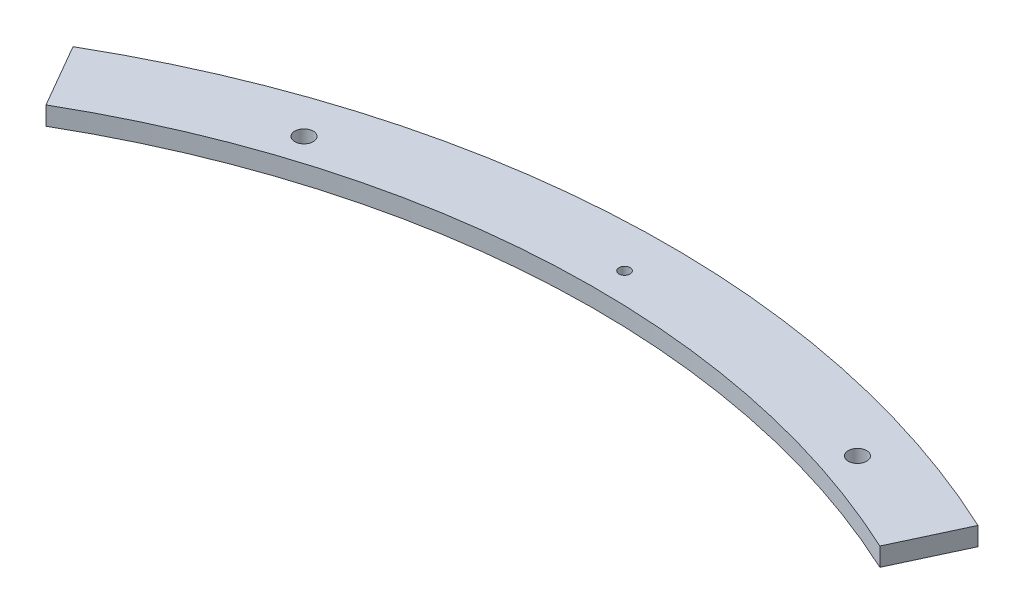
ISO-10303-21;
HEADER;
FILE_DESCRIPTION(('STEP AP214'),'2;1');
FILE_NAME('part.step','',(''),(''),'','','');
FILE_SCHEMA(('AUTOMOTIVE_DESIGN { 1 0 10303 214 1 1 1 1 }'));
ENDSEC;
DATA;
#1=APPLICATION_CONTEXT('core data for automotive mechanical design processes');
#2=APPLICATION_PROTOCOL_DEFINITION('international standard','automotive_design',2000,#1);
#3=PRODUCT_CONTEXT('',#1,'mechanical');
#4=PRODUCT('Part','Part','',(#3));
#5=PRODUCT_RELATED_PRODUCT_CATEGORY('part','',(#4));
#6=PRODUCT_DEFINITION_FORMATION('','',#4);
#7=PRODUCT_DEFINITION_CONTEXT('part definition',#1,'design');
#8=PRODUCT_DEFINITION('design','',#6,#7);
#9=PRODUCT_DEFINITION_SHAPE('','',#8);
#10=(LENGTH_UNIT() NAMED_UNIT(*) SI_UNIT(.MILLI.,.METRE.));
#11=(NAMED_UNIT(*) PLANE_ANGLE_UNIT() SI_UNIT($,.RADIAN.));
#12=(NAMED_UNIT(*) SI_UNIT($,.STERADIAN.) SOLID_ANGLE_UNIT());
#13=UNCERTAINTY_MEASURE_WITH_UNIT(LENGTH_MEASURE(1.E-05),#10,'distance_accuracy_value','');
#14=(GEOMETRIC_REPRESENTATION_CONTEXT(3) GLOBAL_UNCERTAINTY_ASSIGNED_CONTEXT((#13)) GLOBAL_UNIT_ASSIGNED_CONTEXT((#10,
#11,#12)) REPRESENTATION_CONTEXT('',''));
#15=CARTESIAN_POINT('',(0.,0.,0.));
#16=DIRECTION('',(0.,0.,1.));
#17=DIRECTION('',(1.,0.,0.));
#18=AXIS2_PLACEMENT_3D('',#15,#16,#17);
#19=CARTESIAN_POINT('',(0.,5.,0.));
#20=DIRECTION('',(0.,1.,0.));
#21=DIRECTION('',(0.,0.,1.));
#22=AXIS2_PLACEMENT_3D('',#19,#20,#21);
#23=PLANE('',#22);
#24=DIRECTION('',(-0.422618261740704,0.,0.906307787036648));
#25=VECTOR('',#24,1.);
#26=CARTESIAN_POINT('',(0.,5.,0.));
#27=LINE('',#26,#25);
#28=CARTESIAN_POINT('',(107.556347613009,5.,-230.655331800827));
#29=VERTEX_POINT('',#28);
#30=CARTESIAN_POINT('',(99.103982378195,5.,-212.529176060094));
#31=VERTEX_POINT('',#30);
#32=EDGE_CURVE('E47',#29,#31,#27,.T.);
#33=ORIENTED_EDGE('',*,*,#32,.F.);
#34=CARTESIAN_POINT('',(0.,5.,0.));
#35=DIRECTION('',(0.,1.,0.));
#36=DIRECTION('',(0.,0.,1.));
#37=AXIS2_PLACEMENT_3D('',#34,#35,#36);
#38=CIRCLE('',#37,254.5);
#39=CARTESIAN_POINT('',(-127.25,5.,-220.40346526314));
#40=VERTEX_POINT('',#39);
#41=EDGE_CURVE('E84',#29,#40,#38,.T.);
#42=ORIENTED_EDGE('',*,*,#41,.T.);
#43=DIRECTION('',(-0.499999999999998,0.,-0.86602540378444));
#44=VECTOR('',#43,1.);
#45=CARTESIAN_POINT('',(0.,5.,0.));
#46=LINE('',#45,#44);
#47=CARTESIAN_POINT('',(-117.25,5.,-203.082957187451));
#48=VERTEX_POINT('',#47);
#49=EDGE_CURVE('E119',#48,#40,#46,.T.);
#50=ORIENTED_EDGE('',*,*,#49,.F.);
#51=CARTESIAN_POINT('',(0.,5.,0.));
#52=DIRECTION('',(0.,1.,0.));
#53=DIRECTION('',(0.,0.,1.));
#54=AXIS2_PLACEMENT_3D('',#51,#52,#53);
#55=CIRCLE('',#54,234.5);
#56=EDGE_CURVE('E86',#31,#48,#55,.T.);
#57=ORIENTED_EDGE('',*,*,#56,.F.);
#58=EDGE_LOOP('',(#33,#42,#50,#57));
#59=FACE_BOUND('',#58,.T.);
#60=CARTESIAN_POINT('',(-7.07926561869708E-12,5.,-242.499999999991));
#61=DIRECTION('',(0.,1.,0.));
#62=DIRECTION('',(0.,0.,1.));
#63=AXIS2_PLACEMENT_3D('',#60,#61,#62);
#64=CIRCLE('',#63,1.50000000000972);
#65=CARTESIAN_POINT('',(-7.07926561869708E-12,5.,-240.999999999981));
#66=VERTEX_POINT('',#65);
#67=EDGE_CURVE('E103',#66,#66,#64,.T.);
#68=ORIENTED_EDGE('',*,*,#67,.F.);
#69=EDGE_LOOP('',(#68));
#70=FACE_BOUND('',#69,.T.);
#71=CARTESIAN_POINT('',(74.9366211359247,5.,-230.631205201575));
#72=DIRECTION('',(0.,1.,0.));
#73=DIRECTION('',(0.,0.,1.));
#74=AXIS2_PLACEMENT_3D('',#71,#72,#73);
#75=CIRCLE('',#74,2.50000000000001);
#76=CARTESIAN_POINT('',(74.9366211359247,5.,-228.131205201575));
#77=VERTEX_POINT('',#76);
#78=EDGE_CURVE('E99',#77,#77,#75,.T.);
#79=ORIENTED_EDGE('',*,*,#78,.F.);
#80=EDGE_LOOP('',(#79));
#81=FACE_BOUND('',#80,.T.);
#82=CARTESIAN_POINT('',(-74.9366211359248,5.,-230.631205201575));
#83=DIRECTION('',(0.,1.,0.));
#84=DIRECTION('',(0.,0.,1.));
#85=AXIS2_PLACEMENT_3D('',#82,#83,#84);
#86=CIRCLE('',#85,2.5);
#87=CARTESIAN_POINT('',(-74.9366211359248,5.,-228.131205201575));
#88=VERTEX_POINT('',#87);
#89=EDGE_CURVE('E106',#88,#88,#86,.T.);
#90=ORIENTED_EDGE('',*,*,#89,.F.);
#91=EDGE_LOOP('',(#90));
#92=FACE_BOUND('',#91,.T.);
#93=ADVANCED_FACE('F33',(#59,#70,#81,#92),#23,.T.);
#94=CARTESIAN_POINT('',(0.,0.,0.));
#95=DIRECTION('',(0.,1.,0.));
#96=DIRECTION('',(0.,0.,1.));
#97=AXIS2_PLACEMENT_3D('',#94,#95,#96);
#98=PLANE('',#97);
#99=CARTESIAN_POINT('',(-7.07926561869708E-12,0.,-242.499999999991));
#100=DIRECTION('',(0.,1.,0.));
#101=DIRECTION('',(0.,0.,1.));
#102=AXIS2_PLACEMENT_3D('',#99,#100,#101);
#103=CIRCLE('',#102,1.50000000000972);
#104=CARTESIAN_POINT('',(-7.07926561869708E-12,0.,-240.999999999981));
#105=VERTEX_POINT('',#104);
#106=EDGE_CURVE('E111',#105,#105,#103,.T.);
#107=ORIENTED_EDGE('',*,*,#106,.T.);
#108=EDGE_LOOP('',(#107));
#109=FACE_BOUND('',#108,.T.);
#110=CARTESIAN_POINT('',(0.,0.,0.));
#111=DIRECTION('',(0.,1.,0.));
#112=DIRECTION('',(0.,0.,1.));
#113=AXIS2_PLACEMENT_3D('',#110,#111,#112);
#114=CIRCLE('',#113,254.5);
#115=CARTESIAN_POINT('',(107.556347613009,0.,-230.655331800827));
#116=VERTEX_POINT('',#115);
#117=CARTESIAN_POINT('',(-127.25,0.,-220.40346526314));
#118=VERTEX_POINT('',#117);
#119=EDGE_CURVE('E91',#116,#118,#114,.T.);
#120=ORIENTED_EDGE('',*,*,#119,.F.);
#121=DIRECTION('',(-0.422618261740704,0.,0.906307787036648));
#122=VECTOR('',#121,1.);
#123=CARTESIAN_POINT('',(0.,0.,0.));
#124=LINE('',#123,#122);
#125=CARTESIAN_POINT('',(99.103982378195,0.,-212.529176060094));
#126=VERTEX_POINT('',#125);
#127=EDGE_CURVE('E75',#116,#126,#124,.T.);
#128=ORIENTED_EDGE('',*,*,#127,.T.);
#129=CARTESIAN_POINT('',(0.,0.,0.));
#130=DIRECTION('',(0.,1.,0.));
#131=DIRECTION('',(0.,0.,1.));
#132=AXIS2_PLACEMENT_3D('',#129,#130,#131);
#133=CIRCLE('',#132,234.5);
#134=CARTESIAN_POINT('',(-117.25,0.,-203.082957187451));
#135=VERTEX_POINT('',#134);
#136=EDGE_CURVE('E55',#126,#135,#133,.T.);
#137=ORIENTED_EDGE('',*,*,#136,.T.);
#138=DIRECTION('',(-0.499999999999998,0.,-0.86602540378444));
#139=VECTOR('',#138,1.);
#140=CARTESIAN_POINT('',(0.,0.,0.));
#141=LINE('',#140,#139);
#142=EDGE_CURVE('E114',#135,#118,#141,.T.);
#143=ORIENTED_EDGE('',*,*,#142,.T.);
#144=EDGE_LOOP('',(#120,#128,#137,#143));
#145=FACE_BOUND('',#144,.T.);
#146=CARTESIAN_POINT('',(74.9366211359247,0.,-230.631205201575));
#147=DIRECTION('',(0.,1.,0.));
#148=DIRECTION('',(0.,0.,1.));
#149=AXIS2_PLACEMENT_3D('',#146,#147,#148);
#150=CIRCLE('',#149,2.50000000000001);
#151=CARTESIAN_POINT('',(74.9366211359247,0.,-228.131205201575));
#152=VERTEX_POINT('',#151);
#153=EDGE_CURVE('E102',#152,#152,#150,.T.);
#154=ORIENTED_EDGE('',*,*,#153,.T.);
#155=EDGE_LOOP('',(#154));
#156=FACE_BOUND('',#155,.T.);
#157=CARTESIAN_POINT('',(-74.9366211359248,0.,-230.631205201575));
#158=DIRECTION('',(0.,1.,0.));
#159=DIRECTION('',(0.,0.,1.));
#160=AXIS2_PLACEMENT_3D('',#157,#158,#159);
#161=CIRCLE('',#160,2.5);
#162=CARTESIAN_POINT('',(-74.9366211359248,0.,-228.131205201575));
#163=VERTEX_POINT('',#162);
#164=EDGE_CURVE('E97',#163,#163,#161,.T.);
#165=ORIENTED_EDGE('',*,*,#164,.T.);
#166=EDGE_LOOP('',(#165));
#167=FACE_BOUND('',#166,.T.);
#168=ADVANCED_FACE('F121',(#109,#145,#156,#167),#98,.F.);
#169=CARTESIAN_POINT('',(0.,5.,0.));
#170=DIRECTION('',(0.,-1.,0.));
#171=DIRECTION('',(0.,0.,-1.));
#172=AXIS2_PLACEMENT_3D('',#169,#170,#171);
#173=CYLINDRICAL_SURFACE('',#172,254.5);
#174=ORIENTED_EDGE('',*,*,#41,.F.);
#175=DIRECTION('',(0.,1.,0.));
#176=VECTOR('',#175,1.);
#177=CARTESIAN_POINT('',(107.556347613009,-5.,-230.655331800827));
#178=LINE('',#177,#176);
#179=EDGE_CURVE('E73',#116,#29,#178,.T.);
#180=ORIENTED_EDGE('',*,*,#179,.F.);
#181=ORIENTED_EDGE('',*,*,#119,.T.);
#182=DIRECTION('',(0.,1.,0.));
#183=VECTOR('',#182,1.);
#184=CARTESIAN_POINT('',(-127.25,-5.,-220.40346526314));
#185=LINE('',#184,#183);
#186=EDGE_CURVE('E90',#118,#40,#185,.T.);
#187=ORIENTED_EDGE('',*,*,#186,.T.);
#188=EDGE_LOOP('',(#174,#180,#181,#187));
#189=FACE_BOUND('',#188,.T.);
#190=ADVANCED_FACE('F35',(#189),#173,.T.);
#191=CARTESIAN_POINT('',(0.,5.,0.));
#192=DIRECTION('',(0.,-1.,0.));
#193=DIRECTION('',(0.,0.,-1.));
#194=AXIS2_PLACEMENT_3D('',#191,#192,#193);
#195=CYLINDRICAL_SURFACE('',#194,234.5);
#196=DIRECTION('',(0.,-1.,0.));
#197=VECTOR('',#196,1.);
#198=CARTESIAN_POINT('',(99.103982378195,5.,-212.529176060094));
#199=LINE('',#198,#197);
#200=EDGE_CURVE('E11',#31,#126,#199,.T.);
#201=ORIENTED_EDGE('',*,*,#200,.F.);
#202=ORIENTED_EDGE('',*,*,#56,.T.);
#203=DIRECTION('',(0.,-1.,0.));
#204=VECTOR('',#203,1.);
#205=CARTESIAN_POINT('',(-117.25,5.,-203.082957187451));
#206=LINE('',#205,#204);
#207=EDGE_CURVE('E41',#135,#48,#206,.F.);
#208=ORIENTED_EDGE('',*,*,#207,.F.);
#209=ORIENTED_EDGE('',*,*,#136,.F.);
#210=EDGE_LOOP('',(#201,#202,#208,#209));
#211=FACE_BOUND('',#210,.T.);
#212=ADVANCED_FACE('F125',(#211),#195,.F.);
#213=CARTESIAN_POINT('',(-74.9366211359248,0.,-230.631205201575));
#214=DIRECTION('',(0.,1.,0.));
#215=DIRECTION('',(0.,0.,1.));
#216=AXIS2_PLACEMENT_3D('',#213,#214,#215);
#217=CYLINDRICAL_SURFACE('',#216,2.5);
#218=ORIENTED_EDGE('',*,*,#164,.F.);
#219=EDGE_LOOP('',(#218));
#220=FACE_BOUND('',#219,.T.);
#221=ORIENTED_EDGE('',*,*,#89,.T.);
#222=EDGE_LOOP('',(#221));
#223=FACE_BOUND('',#222,.T.);
#224=ADVANCED_FACE('F148',(#220,#223),#217,.F.);
#225=CARTESIAN_POINT('',(74.9366211359247,0.,-230.631205201575));
#226=DIRECTION('',(0.,1.,0.));
#227=DIRECTION('',(0.,0.,1.));
#228=AXIS2_PLACEMENT_3D('',#225,#226,#227);
#229=CYLINDRICAL_SURFACE('',#228,2.50000000000001);
#230=ORIENTED_EDGE('',*,*,#153,.F.);
#231=EDGE_LOOP('',(#230));
#232=FACE_BOUND('',#231,.T.);
#233=ORIENTED_EDGE('',*,*,#78,.T.);
#234=EDGE_LOOP('',(#233));
#235=FACE_BOUND('',#234,.T.);
#236=ADVANCED_FACE('F136',(#232,#235),#229,.F.);
#237=CARTESIAN_POINT('',(-7.07926561869708E-12,0.,-242.499999999991));
#238=DIRECTION('',(0.,1.,0.));
#239=DIRECTION('',(0.,0.,1.));
#240=AXIS2_PLACEMENT_3D('',#237,#238,#239);
#241=CYLINDRICAL_SURFACE('',#240,1.50000000000972);
#242=ORIENTED_EDGE('',*,*,#106,.F.);
#243=EDGE_LOOP('',(#242));
#244=FACE_BOUND('',#243,.T.);
#245=ORIENTED_EDGE('',*,*,#67,.T.);
#246=EDGE_LOOP('',(#245));
#247=FACE_BOUND('',#246,.T.);
#248=ADVANCED_FACE('F129',(#244,#247),#241,.F.);
#249=CARTESIAN_POINT('',(0.,-5.,0.));
#250=DIRECTION('',(0.86602540378444,0.,-0.499999999999998));
#251=DIRECTION('',(-0.499999999999998,0.,-0.86602540378444));
#252=AXIS2_PLACEMENT_3D('',#249,#250,#251);
#253=PLANE('',#252);
#254=ORIENTED_EDGE('',*,*,#207,.T.);
#255=ORIENTED_EDGE('',*,*,#49,.T.);
#256=ORIENTED_EDGE('',*,*,#186,.F.);
#257=ORIENTED_EDGE('',*,*,#142,.F.);
#258=EDGE_LOOP('',(#254,#255,#256,#257));
#259=FACE_BOUND('',#258,.T.);
#260=ADVANCED_FACE('F127',(#259),#253,.F.);
#261=CARTESIAN_POINT('',(0.,-5.,0.));
#262=DIRECTION('',(-0.906307787036648,0.,-0.422618261740704));
#263=DIRECTION('',(-0.422618261740704,0.,0.906307787036648));
#264=AXIS2_PLACEMENT_3D('',#261,#262,#263);
#265=PLANE('',#264);
#266=ORIENTED_EDGE('',*,*,#179,.T.);
#267=ORIENTED_EDGE('',*,*,#32,.T.);
#268=ORIENTED_EDGE('',*,*,#200,.T.);
#269=ORIENTED_EDGE('',*,*,#127,.F.);
#270=EDGE_LOOP('',(#266,#267,#268,#269));
#271=FACE_BOUND('',#270,.T.);
#272=ADVANCED_FACE('F74',(#271),#265,.F.);
#273=CLOSED_SHELL('',(#93,#168,#190,#212,#224,#236,#248,#260,#272));
#274=MANIFOLD_SOLID_BREP('B2',#273);
#275=ADVANCED_BREP_SHAPE_REPRESENTATION('',(#18,#274),#14);
#276=SHAPE_DEFINITION_REPRESENTATION(#9,#275);
ENDSEC;
END-ISO-10303-21;
